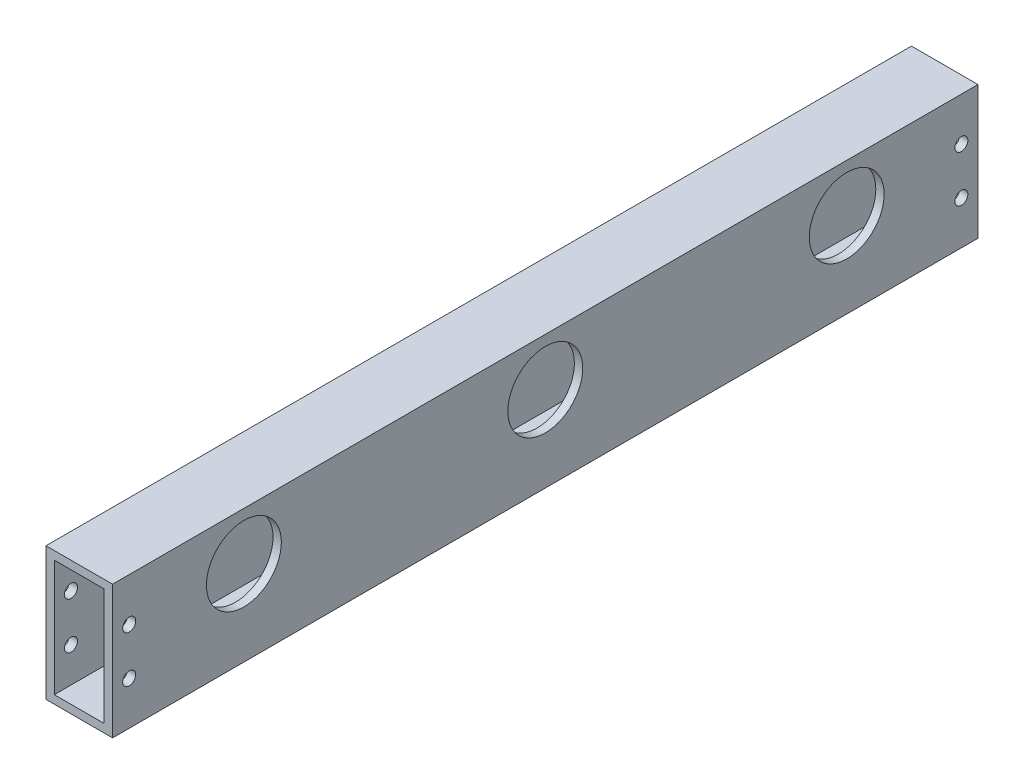
ISO-10303-21;
HEADER;
FILE_DESCRIPTION(('STEP AP214'),'2;1');
FILE_NAME('part.step','',(''),(''),'','','');
FILE_SCHEMA(('AUTOMOTIVE_DESIGN { 1 0 10303 214 1 1 1 1 }'));
ENDSEC;
DATA;
#1=APPLICATION_CONTEXT('core data for automotive mechanical design processes');
#2=APPLICATION_PROTOCOL_DEFINITION('international standard','automotive_design',2000,#1);
#3=PRODUCT_CONTEXT('',#1,'mechanical');
#4=PRODUCT('Part','Part','',(#3));
#5=PRODUCT_RELATED_PRODUCT_CATEGORY('part','',(#4));
#6=PRODUCT_DEFINITION_FORMATION('','',#4);
#7=PRODUCT_DEFINITION_CONTEXT('part definition',#1,'design');
#8=PRODUCT_DEFINITION('design','',#6,#7);
#9=PRODUCT_DEFINITION_SHAPE('','',#8);
#10=(LENGTH_UNIT() NAMED_UNIT(*) SI_UNIT(.MILLI.,.METRE.));
#11=(NAMED_UNIT(*) PLANE_ANGLE_UNIT() SI_UNIT($,.RADIAN.));
#12=(NAMED_UNIT(*) SI_UNIT($,.STERADIAN.) SOLID_ANGLE_UNIT());
#13=UNCERTAINTY_MEASURE_WITH_UNIT(LENGTH_MEASURE(1.E-05),#10,'distance_accuracy_value','');
#14=(GEOMETRIC_REPRESENTATION_CONTEXT(3) GLOBAL_UNCERTAINTY_ASSIGNED_CONTEXT((#13)) GLOBAL_UNIT_ASSIGNED_CONTEXT((#10,
#11,#12)) REPRESENTATION_CONTEXT('',''));
#15=CARTESIAN_POINT('',(0.,0.,0.));
#16=DIRECTION('',(0.,0.,1.));
#17=DIRECTION('',(1.,0.,0.));
#18=AXIS2_PLACEMENT_3D('',#15,#16,#17);
#19=CARTESIAN_POINT('',(25.4,0.,165.1));
#20=DIRECTION('',(0.,0.,-1.));
#21=DIRECTION('',(-1.,0.,0.));
#22=AXIS2_PLACEMENT_3D('',#19,#20,#21);
#23=PLANE('',#22);
#24=DIRECTION('',(0.,-1.,0.));
#25=VECTOR('',#24,1.);
#26=CARTESIAN_POINT('',(0.,0.,165.1));
#27=LINE('',#26,#25);
#28=CARTESIAN_POINT('',(0.,25.4,165.1));
#29=VERTEX_POINT('',#28);
#30=CARTESIAN_POINT('',(0.,-25.4,165.1));
#31=VERTEX_POINT('',#30);
#32=EDGE_CURVE('E226',#29,#31,#27,.T.);
#33=ORIENTED_EDGE('',*,*,#32,.T.);
#34=DIRECTION('',(-1.,0.,0.));
#35=VECTOR('',#34,1.);
#36=CARTESIAN_POINT('',(25.4,-25.4,165.1));
#37=LINE('',#36,#35);
#38=CARTESIAN_POINT('',(25.4,-25.4,165.1));
#39=VERTEX_POINT('',#38);
#40=EDGE_CURVE('E55',#39,#31,#37,.T.);
#41=ORIENTED_EDGE('',*,*,#40,.F.);
#42=DIRECTION('',(0.,-1.,0.));
#43=VECTOR('',#42,1.);
#44=CARTESIAN_POINT('',(25.4,0.,165.1));
#45=LINE('',#44,#43);
#46=CARTESIAN_POINT('',(25.4,25.4,165.1));
#47=VERTEX_POINT('',#46);
#48=EDGE_CURVE('E199',#47,#39,#45,.T.);
#49=ORIENTED_EDGE('',*,*,#48,.F.);
#50=DIRECTION('',(-1.,0.,0.));
#51=VECTOR('',#50,1.);
#52=CARTESIAN_POINT('',(25.4,25.4,165.1));
#53=LINE('',#52,#51);
#54=EDGE_CURVE('E11',#47,#29,#53,.T.);
#55=ORIENTED_EDGE('',*,*,#54,.T.);
#56=EDGE_LOOP('',(#33,#41,#49,#55));
#57=FACE_BOUND('',#56,.T.);
#58=DIRECTION('',(0.,-1.,0.));
#59=VECTOR('',#58,1.);
#60=CARTESIAN_POINT('',(3.175,0.,165.1));
#61=LINE('',#60,#59);
#62=CARTESIAN_POINT('',(3.175,22.225,165.1));
#63=VERTEX_POINT('',#62);
#64=CARTESIAN_POINT('',(3.175,-22.225,165.1));
#65=VERTEX_POINT('',#64);
#66=EDGE_CURVE('E127',#63,#65,#61,.T.);
#67=ORIENTED_EDGE('',*,*,#66,.F.);
#68=DIRECTION('',(-1.,0.,0.));
#69=VECTOR('',#68,1.);
#70=CARTESIAN_POINT('',(25.4,22.225,165.1));
#71=LINE('',#70,#69);
#72=CARTESIAN_POINT('',(22.225,22.225,165.1));
#73=VERTEX_POINT('',#72);
#74=EDGE_CURVE('E112',#73,#63,#71,.T.);
#75=ORIENTED_EDGE('',*,*,#74,.F.);
#76=DIRECTION('',(0.,-1.,0.));
#77=VECTOR('',#76,1.);
#78=CARTESIAN_POINT('',(22.225,0.,165.1));
#79=LINE('',#78,#77);
#80=CARTESIAN_POINT('',(22.225,-22.225,165.1));
#81=VERTEX_POINT('',#80);
#82=EDGE_CURVE('E145',#73,#81,#79,.T.);
#83=ORIENTED_EDGE('',*,*,#82,.T.);
#84=DIRECTION('',(-1.,0.,0.));
#85=VECTOR('',#84,1.);
#86=CARTESIAN_POINT('',(25.4,-22.225,165.1));
#87=LINE('',#86,#85);
#88=EDGE_CURVE('E122',#81,#65,#87,.T.);
#89=ORIENTED_EDGE('',*,*,#88,.T.);
#90=EDGE_LOOP('',(#67,#75,#83,#89));
#91=FACE_BOUND('',#90,.T.);
#92=ADVANCED_FACE('F45',(#57,#91),#23,.F.);
#93=CARTESIAN_POINT('',(25.4,7.112,0.));
#94=DIRECTION('',(-1.,0.,0.));
#95=DIRECTION('',(0.,0.,1.));
#96=AXIS2_PLACEMENT_3D('',#93,#94,#95);
#97=CYLINDRICAL_SURFACE('',#96,14.2875);
#98=CARTESIAN_POINT('',(0.,7.112,0.));
#99=DIRECTION('',(1.,0.,0.));
#100=DIRECTION('',(0.,0.,-1.));
#101=AXIS2_PLACEMENT_3D('',#98,#99,#100);
#102=CIRCLE('',#101,14.2875);
#103=CARTESIAN_POINT('',(0.,7.112,-14.2875));
#104=VERTEX_POINT('',#103);
#105=EDGE_CURVE('E218',#104,#104,#102,.T.);
#106=ORIENTED_EDGE('',*,*,#105,.F.);
#107=EDGE_LOOP('',(#106));
#108=FACE_BOUND('',#107,.T.);
#109=CARTESIAN_POINT('',(3.175,7.112,0.));
#110=DIRECTION('',(1.,0.,0.));
#111=DIRECTION('',(0.,0.,-1.));
#112=AXIS2_PLACEMENT_3D('',#109,#110,#111);
#113=CIRCLE('',#112,14.2875);
#114=CARTESIAN_POINT('',(3.175,7.112,-14.2875));
#115=VERTEX_POINT('',#114);
#116=EDGE_CURVE('E133',#115,#115,#113,.T.);
#117=ORIENTED_EDGE('',*,*,#116,.T.);
#118=EDGE_LOOP('',(#117));
#119=FACE_BOUND('',#118,.T.);
#120=ADVANCED_FACE('F307',(#108,#119),#97,.F.);
#121=CARTESIAN_POINT('',(25.4,7.11200000000001,115.));
#122=DIRECTION('',(-1.,0.,0.));
#123=DIRECTION('',(0.,0.,1.));
#124=AXIS2_PLACEMENT_3D('',#121,#122,#123);
#125=CYLINDRICAL_SURFACE('',#124,14.2875);
#126=CARTESIAN_POINT('',(0.,7.11200000000001,115.));
#127=DIRECTION('',(1.,0.,0.));
#128=DIRECTION('',(0.,0.,-1.));
#129=AXIS2_PLACEMENT_3D('',#126,#127,#128);
#130=CIRCLE('',#129,14.2875);
#131=CARTESIAN_POINT('',(0.,7.11200000000001,100.7125));
#132=VERTEX_POINT('',#131);
#133=EDGE_CURVE('E214',#132,#132,#130,.T.);
#134=ORIENTED_EDGE('',*,*,#133,.F.);
#135=EDGE_LOOP('',(#134));
#136=FACE_BOUND('',#135,.T.);
#137=CARTESIAN_POINT('',(3.175,7.11200000000001,115.));
#138=DIRECTION('',(1.,0.,0.));
#139=DIRECTION('',(0.,0.,-1.));
#140=AXIS2_PLACEMENT_3D('',#137,#138,#139);
#141=CIRCLE('',#140,14.2875);
#142=CARTESIAN_POINT('',(3.175,7.11200000000001,100.7125));
#143=VERTEX_POINT('',#142);
#144=EDGE_CURVE('E174',#143,#143,#141,.T.);
#145=ORIENTED_EDGE('',*,*,#144,.T.);
#146=EDGE_LOOP('',(#145));
#147=FACE_BOUND('',#146,.T.);
#148=ADVANCED_FACE('F301',(#136,#147),#125,.F.);
#149=CARTESIAN_POINT('',(25.4,7.112,-115.));
#150=DIRECTION('',(-1.,0.,0.));
#151=DIRECTION('',(0.,0.,1.));
#152=AXIS2_PLACEMENT_3D('',#149,#150,#151);
#153=CYLINDRICAL_SURFACE('',#152,14.2875);
#154=CARTESIAN_POINT('',(0.,7.112,-115.));
#155=DIRECTION('',(1.,0.,0.));
#156=DIRECTION('',(0.,0.,-1.));
#157=AXIS2_PLACEMENT_3D('',#154,#155,#156);
#158=CIRCLE('',#157,14.2875);
#159=CARTESIAN_POINT('',(0.,7.112,-129.2875));
#160=VERTEX_POINT('',#159);
#161=EDGE_CURVE('E121',#160,#160,#158,.T.);
#162=ORIENTED_EDGE('',*,*,#161,.F.);
#163=EDGE_LOOP('',(#162));
#164=FACE_BOUND('',#163,.T.);
#165=CARTESIAN_POINT('',(3.175,7.112,-115.));
#166=DIRECTION('',(1.,0.,0.));
#167=DIRECTION('',(0.,0.,-1.));
#168=AXIS2_PLACEMENT_3D('',#165,#166,#167);
#169=CIRCLE('',#168,14.2875);
#170=CARTESIAN_POINT('',(3.175,7.112,-129.2875));
#171=VERTEX_POINT('',#170);
#172=EDGE_CURVE('E170',#171,#171,#169,.T.);
#173=ORIENTED_EDGE('',*,*,#172,.T.);
#174=EDGE_LOOP('',(#173));
#175=FACE_BOUND('',#174,.T.);
#176=ADVANCED_FACE('F291',(#164,#175),#153,.F.);
#177=CARTESIAN_POINT('',(25.4,0.,-165.1));
#178=DIRECTION('',(0.,0.,-1.));
#179=DIRECTION('',(-1.,0.,0.));
#180=AXIS2_PLACEMENT_3D('',#177,#178,#179);
#181=PLANE('',#180);
#182=DIRECTION('',(0.,-1.,0.));
#183=VECTOR('',#182,1.);
#184=CARTESIAN_POINT('',(0.,0.,-165.1));
#185=LINE('',#184,#183);
#186=CARTESIAN_POINT('',(0.,25.4,-165.1));
#187=VERTEX_POINT('',#186);
#188=CARTESIAN_POINT('',(0.,-25.4,-165.1));
#189=VERTEX_POINT('',#188);
#190=EDGE_CURVE('E187',#187,#189,#185,.T.);
#191=ORIENTED_EDGE('',*,*,#190,.F.);
#192=DIRECTION('',(-1.,0.,0.));
#193=VECTOR('',#192,1.);
#194=CARTESIAN_POINT('',(25.4,25.4,-165.1));
#195=LINE('',#194,#193);
#196=CARTESIAN_POINT('',(25.4,25.4,-165.1));
#197=VERTEX_POINT('',#196);
#198=EDGE_CURVE('E210',#197,#187,#195,.T.);
#199=ORIENTED_EDGE('',*,*,#198,.F.);
#200=DIRECTION('',(0.,-1.,0.));
#201=VECTOR('',#200,1.);
#202=CARTESIAN_POINT('',(25.4,0.,-165.1));
#203=LINE('',#202,#201);
#204=CARTESIAN_POINT('',(25.4,-25.4,-165.1));
#205=VERTEX_POINT('',#204);
#206=EDGE_CURVE('E206',#197,#205,#203,.T.);
#207=ORIENTED_EDGE('',*,*,#206,.T.);
#208=DIRECTION('',(-1.,0.,0.));
#209=VECTOR('',#208,1.);
#210=CARTESIAN_POINT('',(25.4,-25.4,-165.1));
#211=LINE('',#210,#209);
#212=EDGE_CURVE('E239',#205,#189,#211,.T.);
#213=ORIENTED_EDGE('',*,*,#212,.T.);
#214=EDGE_LOOP('',(#191,#199,#207,#213));
#215=FACE_BOUND('',#214,.T.);
#216=DIRECTION('',(-1.,0.,0.));
#217=VECTOR('',#216,1.);
#218=CARTESIAN_POINT('',(25.4,22.225,-165.1));
#219=LINE('',#218,#217);
#220=CARTESIAN_POINT('',(22.225,22.225,-165.1));
#221=VERTEX_POINT('',#220);
#222=CARTESIAN_POINT('',(3.175,22.225,-165.1));
#223=VERTEX_POINT('',#222);
#224=EDGE_CURVE('E149',#221,#223,#219,.T.);
#225=ORIENTED_EDGE('',*,*,#224,.T.);
#226=DIRECTION('',(0.,-1.,0.));
#227=VECTOR('',#226,1.);
#228=CARTESIAN_POINT('',(3.175,0.,-165.1));
#229=LINE('',#228,#227);
#230=CARTESIAN_POINT('',(3.175,-22.225,-165.1));
#231=VERTEX_POINT('',#230);
#232=EDGE_CURVE('E130',#223,#231,#229,.T.);
#233=ORIENTED_EDGE('',*,*,#232,.T.);
#234=DIRECTION('',(-1.,0.,0.));
#235=VECTOR('',#234,1.);
#236=CARTESIAN_POINT('',(25.4,-22.225,-165.1));
#237=LINE('',#236,#235);
#238=CARTESIAN_POINT('',(22.225,-22.225,-165.1));
#239=VERTEX_POINT('',#238);
#240=EDGE_CURVE('E144',#239,#231,#237,.T.);
#241=ORIENTED_EDGE('',*,*,#240,.F.);
#242=DIRECTION('',(0.,-1.,0.));
#243=VECTOR('',#242,1.);
#244=CARTESIAN_POINT('',(22.225,0.,-165.1));
#245=LINE('',#244,#243);
#246=EDGE_CURVE('E70',#221,#239,#245,.T.);
#247=ORIENTED_EDGE('',*,*,#246,.F.);
#248=EDGE_LOOP('',(#225,#233,#241,#247));
#249=FACE_BOUND('',#248,.T.);
#250=ADVANCED_FACE('F288',(#215,#249),#181,.T.);
#251=CARTESIAN_POINT('',(25.4,25.4,0.));
#252=DIRECTION('',(0.,-1.,0.));
#253=DIRECTION('',(0.,0.,-1.));
#254=AXIS2_PLACEMENT_3D('',#251,#252,#253);
#255=PLANE('',#254);
#256=DIRECTION('',(0.,0.,1.));
#257=VECTOR('',#256,1.);
#258=CARTESIAN_POINT('',(0.,25.4,0.));
#259=LINE('',#258,#257);
#260=EDGE_CURVE('E222',#187,#29,#259,.T.);
#261=ORIENTED_EDGE('',*,*,#260,.T.);
#262=ORIENTED_EDGE('',*,*,#54,.F.);
#263=DIRECTION('',(0.,0.,1.));
#264=VECTOR('',#263,1.);
#265=CARTESIAN_POINT('',(25.4,25.4,0.));
#266=LINE('',#265,#264);
#267=EDGE_CURVE('E195',#197,#47,#266,.T.);
#268=ORIENTED_EDGE('',*,*,#267,.F.);
#269=ORIENTED_EDGE('',*,*,#198,.T.);
#270=EDGE_LOOP('',(#261,#262,#268,#269));
#271=FACE_BOUND('',#270,.T.);
#272=ADVANCED_FACE('F290',(#271),#255,.F.);
#273=CARTESIAN_POINT('',(25.4,-25.4,0.));
#274=DIRECTION('',(0.,-1.,0.));
#275=DIRECTION('',(0.,0.,-1.));
#276=AXIS2_PLACEMENT_3D('',#273,#274,#275);
#277=PLANE('',#276);
#278=DIRECTION('',(0.,0.,1.));
#279=VECTOR('',#278,1.);
#280=CARTESIAN_POINT('',(0.,-25.4,0.));
#281=LINE('',#280,#279);
#282=EDGE_CURVE('E230',#189,#31,#281,.T.);
#283=ORIENTED_EDGE('',*,*,#282,.F.);
#284=ORIENTED_EDGE('',*,*,#212,.F.);
#285=DIRECTION('',(0.,0.,1.));
#286=VECTOR('',#285,1.);
#287=CARTESIAN_POINT('',(25.4,-25.4,0.));
#288=LINE('',#287,#286);
#289=EDGE_CURVE('E202',#205,#39,#288,.T.);
#290=ORIENTED_EDGE('',*,*,#289,.T.);
#291=ORIENTED_EDGE('',*,*,#40,.T.);
#292=EDGE_LOOP('',(#283,#284,#290,#291));
#293=FACE_BOUND('',#292,.T.);
#294=ADVANCED_FACE('F298',(#293),#277,.T.);
#295=CARTESIAN_POINT('',(22.225,7.112,0.));
#296=DIRECTION('',(1.,0.,0.));
#297=DIRECTION('',(0.,0.,-1.));
#298=AXIS2_PLACEMENT_3D('',#295,#296,#297);
#299=CIRCLE('',#298,14.2875);
#300=CARTESIAN_POINT('',(22.225,7.112,-14.2875));
#301=VERTEX_POINT('',#300);
#302=EDGE_CURVE('E166',#301,#301,#299,.T.);
#303=ORIENTED_EDGE('',*,*,#302,.F.);
#304=EDGE_LOOP('',(#303));
#305=FACE_BOUND('',#304,.T.);
#306=CARTESIAN_POINT('',(25.4,7.112,0.));
#307=DIRECTION('',(1.,0.,0.));
#308=DIRECTION('',(0.,0.,-1.));
#309=AXIS2_PLACEMENT_3D('',#306,#307,#308);
#310=CIRCLE('',#309,14.2875);
#311=CARTESIAN_POINT('',(25.4,7.112,-14.2875));
#312=VERTEX_POINT('',#311);
#313=EDGE_CURVE('E191',#312,#312,#310,.T.);
#314=ORIENTED_EDGE('',*,*,#313,.T.);
#315=EDGE_LOOP('',(#314));
#316=FACE_BOUND('',#315,.T.);
#317=ADVANCED_FACE('F315',(#305,#316),#97,.F.);
#318=CARTESIAN_POINT('',(22.225,7.11200000000001,115.));
#319=DIRECTION('',(1.,0.,0.));
#320=DIRECTION('',(0.,0.,-1.));
#321=AXIS2_PLACEMENT_3D('',#318,#319,#320);
#322=CIRCLE('',#321,14.2875);
#323=CARTESIAN_POINT('',(22.225,7.11200000000001,100.7125));
#324=VERTEX_POINT('',#323);
#325=EDGE_CURVE('E162',#324,#324,#322,.T.);
#326=ORIENTED_EDGE('',*,*,#325,.F.);
#327=EDGE_LOOP('',(#326));
#328=FACE_BOUND('',#327,.T.);
#329=CARTESIAN_POINT('',(25.4,7.11200000000001,115.));
#330=DIRECTION('',(1.,0.,0.));
#331=DIRECTION('',(0.,0.,-1.));
#332=AXIS2_PLACEMENT_3D('',#329,#330,#331);
#333=CIRCLE('',#332,14.2875);
#334=CARTESIAN_POINT('',(25.4,7.11200000000001,100.7125));
#335=VERTEX_POINT('',#334);
#336=EDGE_CURVE('E186',#335,#335,#333,.T.);
#337=ORIENTED_EDGE('',*,*,#336,.T.);
#338=EDGE_LOOP('',(#337));
#339=FACE_BOUND('',#338,.T.);
#340=ADVANCED_FACE('F317',(#328,#339),#125,.F.);
#341=CARTESIAN_POINT('',(22.225,7.112,-115.));
#342=DIRECTION('',(1.,0.,0.));
#343=DIRECTION('',(0.,0.,-1.));
#344=AXIS2_PLACEMENT_3D('',#341,#342,#343);
#345=CIRCLE('',#344,14.2875);
#346=CARTESIAN_POINT('',(22.225,7.112,-129.2875));
#347=VERTEX_POINT('',#346);
#348=EDGE_CURVE('E158',#347,#347,#345,.T.);
#349=ORIENTED_EDGE('',*,*,#348,.F.);
#350=EDGE_LOOP('',(#349));
#351=FACE_BOUND('',#350,.T.);
#352=CARTESIAN_POINT('',(25.4,7.112,-115.));
#353=DIRECTION('',(1.,0.,0.));
#354=DIRECTION('',(0.,0.,-1.));
#355=AXIS2_PLACEMENT_3D('',#352,#353,#354);
#356=CIRCLE('',#355,14.2875);
#357=CARTESIAN_POINT('',(25.4,7.112,-129.2875));
#358=VERTEX_POINT('',#357);
#359=EDGE_CURVE('E182',#358,#358,#356,.T.);
#360=ORIENTED_EDGE('',*,*,#359,.T.);
#361=EDGE_LOOP('',(#360));
#362=FACE_BOUND('',#361,.T.);
#363=ADVANCED_FACE('F47',(#351,#362),#153,.F.);
#364=CARTESIAN_POINT('',(25.4,0.,0.));
#365=DIRECTION('',(1.,0.,0.));
#366=DIRECTION('',(0.,0.,-1.));
#367=AXIS2_PLACEMENT_3D('',#364,#365,#366);
#368=PLANE('',#367);
#369=CARTESIAN_POINT('',(25.4,8.89,-158.75));
#370=DIRECTION('',(1.,0.,0.));
#371=DIRECTION('',(0.,0.,-1.));
#372=AXIS2_PLACEMENT_3D('',#369,#370,#371);
#373=CIRCLE('',#372,2.4892);
#374=CARTESIAN_POINT('',(25.4,8.89,-161.2392));
#375=VERTEX_POINT('',#374);
#376=EDGE_CURVE('E596',#375,#375,#373,.T.);
#377=ORIENTED_EDGE('',*,*,#376,.F.);
#378=EDGE_LOOP('',(#377));
#379=FACE_BOUND('',#378,.T.);
#380=CARTESIAN_POINT('',(25.4,-8.89,-158.75));
#381=DIRECTION('',(1.,0.,0.));
#382=DIRECTION('',(0.,0.,-1.));
#383=AXIS2_PLACEMENT_3D('',#380,#381,#382);
#384=CIRCLE('',#383,2.4892);
#385=CARTESIAN_POINT('',(25.4,-8.89,-161.2392));
#386=VERTEX_POINT('',#385);
#387=EDGE_CURVE('E606',#386,#386,#384,.T.);
#388=ORIENTED_EDGE('',*,*,#387,.F.);
#389=EDGE_LOOP('',(#388));
#390=FACE_BOUND('',#389,.T.);
#391=CARTESIAN_POINT('',(25.4,8.89,158.75));
#392=DIRECTION('',(1.,0.,0.));
#393=DIRECTION('',(0.,0.,-1.));
#394=AXIS2_PLACEMENT_3D('',#391,#392,#393);
#395=CIRCLE('',#394,2.4892);
#396=CARTESIAN_POINT('',(25.4,8.89,156.2608));
#397=VERTEX_POINT('',#396);
#398=EDGE_CURVE('E256',#397,#397,#395,.T.);
#399=ORIENTED_EDGE('',*,*,#398,.F.);
#400=EDGE_LOOP('',(#399));
#401=FACE_BOUND('',#400,.T.);
#402=CARTESIAN_POINT('',(25.4,-8.89,158.75));
#403=DIRECTION('',(1.,0.,0.));
#404=DIRECTION('',(0.,0.,-1.));
#405=AXIS2_PLACEMENT_3D('',#402,#403,#404);
#406=CIRCLE('',#405,2.4892);
#407=CARTESIAN_POINT('',(25.4,-8.89,156.2608));
#408=VERTEX_POINT('',#407);
#409=EDGE_CURVE('E253',#408,#408,#406,.T.);
#410=ORIENTED_EDGE('',*,*,#409,.F.);
#411=EDGE_LOOP('',(#410));
#412=FACE_BOUND('',#411,.T.);
#413=ORIENTED_EDGE('',*,*,#359,.F.);
#414=EDGE_LOOP('',(#413));
#415=FACE_BOUND('',#414,.T.);
#416=ORIENTED_EDGE('',*,*,#336,.F.);
#417=EDGE_LOOP('',(#416));
#418=FACE_BOUND('',#417,.T.);
#419=ORIENTED_EDGE('',*,*,#313,.F.);
#420=EDGE_LOOP('',(#419));
#421=FACE_BOUND('',#420,.T.);
#422=ORIENTED_EDGE('',*,*,#267,.T.);
#423=ORIENTED_EDGE('',*,*,#48,.T.);
#424=ORIENTED_EDGE('',*,*,#289,.F.);
#425=ORIENTED_EDGE('',*,*,#206,.F.);
#426=EDGE_LOOP('',(#422,#423,#424,#425));
#427=FACE_BOUND('',#426,.T.);
#428=ADVANCED_FACE('F324',(#379,#390,#401,#412,#415,#418,#421,#427),#368,.T.);
#429=CARTESIAN_POINT('',(0.,0.,0.));
#430=DIRECTION('',(1.,0.,0.));
#431=DIRECTION('',(0.,0.,-1.));
#432=AXIS2_PLACEMENT_3D('',#429,#430,#431);
#433=PLANE('',#432);
#434=CARTESIAN_POINT('',(0.,8.89,-158.75));
#435=DIRECTION('',(1.,0.,0.));
#436=DIRECTION('',(0.,0.,-1.));
#437=AXIS2_PLACEMENT_3D('',#434,#435,#436);
#438=CIRCLE('',#437,2.48919999999999);
#439=CARTESIAN_POINT('',(0.,8.89,-161.2392));
#440=VERTEX_POINT('',#439);
#441=EDGE_CURVE('E368',#440,#440,#438,.T.);
#442=ORIENTED_EDGE('',*,*,#441,.T.);
#443=EDGE_LOOP('',(#442));
#444=FACE_BOUND('',#443,.T.);
#445=CARTESIAN_POINT('',(0.,-8.89,-158.75));
#446=DIRECTION('',(1.,0.,0.));
#447=DIRECTION('',(0.,0.,-1.));
#448=AXIS2_PLACEMENT_3D('',#445,#446,#447);
#449=CIRCLE('',#448,2.48919999999999);
#450=CARTESIAN_POINT('',(0.,-8.89,-161.2392));
#451=VERTEX_POINT('',#450);
#452=EDGE_CURVE('E371',#451,#451,#449,.T.);
#453=ORIENTED_EDGE('',*,*,#452,.T.);
#454=EDGE_LOOP('',(#453));
#455=FACE_BOUND('',#454,.T.);
#456=CARTESIAN_POINT('',(0.,8.89,158.75));
#457=DIRECTION('',(1.,0.,0.));
#458=DIRECTION('',(0.,0.,-1.));
#459=AXIS2_PLACEMENT_3D('',#456,#457,#458);
#460=CIRCLE('',#459,2.48919999999999);
#461=CARTESIAN_POINT('',(0.,8.89,156.2608));
#462=VERTEX_POINT('',#461);
#463=EDGE_CURVE('E247',#462,#462,#460,.T.);
#464=ORIENTED_EDGE('',*,*,#463,.T.);
#465=EDGE_LOOP('',(#464));
#466=FACE_BOUND('',#465,.T.);
#467=CARTESIAN_POINT('',(0.,-8.89,158.75));
#468=DIRECTION('',(1.,0.,0.));
#469=DIRECTION('',(0.,0.,-1.));
#470=AXIS2_PLACEMENT_3D('',#467,#468,#469);
#471=CIRCLE('',#470,2.48919999999999);
#472=CARTESIAN_POINT('',(0.,-8.89,156.2608));
#473=VERTEX_POINT('',#472);
#474=EDGE_CURVE('E269',#473,#473,#471,.T.);
#475=ORIENTED_EDGE('',*,*,#474,.T.);
#476=EDGE_LOOP('',(#475));
#477=FACE_BOUND('',#476,.T.);
#478=ORIENTED_EDGE('',*,*,#161,.T.);
#479=EDGE_LOOP('',(#478));
#480=FACE_BOUND('',#479,.T.);
#481=ORIENTED_EDGE('',*,*,#133,.T.);
#482=EDGE_LOOP('',(#481));
#483=FACE_BOUND('',#482,.T.);
#484=ORIENTED_EDGE('',*,*,#105,.T.);
#485=EDGE_LOOP('',(#484));
#486=FACE_BOUND('',#485,.T.);
#487=ORIENTED_EDGE('',*,*,#260,.F.);
#488=ORIENTED_EDGE('',*,*,#190,.T.);
#489=ORIENTED_EDGE('',*,*,#282,.T.);
#490=ORIENTED_EDGE('',*,*,#32,.F.);
#491=EDGE_LOOP('',(#487,#488,#489,#490));
#492=FACE_BOUND('',#491,.T.);
#493=ADVANCED_FACE('F357',(#444,#455,#466,#477,#480,#483,#486,#492),#433,.F.);
#494=CARTESIAN_POINT('',(25.4,22.225,0.));
#495=DIRECTION('',(0.,-1.,0.));
#496=DIRECTION('',(0.,0.,-1.));
#497=AXIS2_PLACEMENT_3D('',#494,#495,#496);
#498=PLANE('',#497);
#499=DIRECTION('',(0.,0.,1.));
#500=VECTOR('',#499,1.);
#501=CARTESIAN_POINT('',(3.175,22.225,0.));
#502=LINE('',#501,#500);
#503=EDGE_CURVE('E115',#223,#63,#502,.T.);
#504=ORIENTED_EDGE('',*,*,#503,.F.);
#505=ORIENTED_EDGE('',*,*,#224,.F.);
#506=DIRECTION('',(0.,0.,1.));
#507=VECTOR('',#506,1.);
#508=CARTESIAN_POINT('',(22.225,22.225,0.));
#509=LINE('',#508,#507);
#510=EDGE_CURVE('E63',#221,#73,#509,.T.);
#511=ORIENTED_EDGE('',*,*,#510,.T.);
#512=ORIENTED_EDGE('',*,*,#74,.T.);
#513=EDGE_LOOP('',(#504,#505,#511,#512));
#514=FACE_BOUND('',#513,.T.);
#515=ADVANCED_FACE('F114',(#514),#498,.T.);
#516=CARTESIAN_POINT('',(25.4,-22.225,0.));
#517=DIRECTION('',(0.,-1.,0.));
#518=DIRECTION('',(0.,0.,-1.));
#519=AXIS2_PLACEMENT_3D('',#516,#517,#518);
#520=PLANE('',#519);
#521=DIRECTION('',(0.,0.,1.));
#522=VECTOR('',#521,1.);
#523=CARTESIAN_POINT('',(3.175,-22.225,0.));
#524=LINE('',#523,#522);
#525=EDGE_CURVE('E137',#231,#65,#524,.T.);
#526=ORIENTED_EDGE('',*,*,#525,.T.);
#527=ORIENTED_EDGE('',*,*,#88,.F.);
#528=DIRECTION('',(0.,0.,1.));
#529=VECTOR('',#528,1.);
#530=CARTESIAN_POINT('',(22.225,-22.225,0.));
#531=LINE('',#530,#529);
#532=EDGE_CURVE('E148',#239,#81,#531,.T.);
#533=ORIENTED_EDGE('',*,*,#532,.F.);
#534=ORIENTED_EDGE('',*,*,#240,.T.);
#535=EDGE_LOOP('',(#526,#527,#533,#534));
#536=FACE_BOUND('',#535,.T.);
#537=ADVANCED_FACE('F286',(#536),#520,.F.);
#538=CARTESIAN_POINT('',(22.225,0.,0.));
#539=DIRECTION('',(1.,0.,0.));
#540=DIRECTION('',(0.,0.,-1.));
#541=AXIS2_PLACEMENT_3D('',#538,#539,#540);
#542=PLANE('',#541);
#543=CARTESIAN_POINT('',(22.225,8.89,-158.75));
#544=DIRECTION('',(1.,0.,0.));
#545=DIRECTION('',(0.,0.,-1.));
#546=AXIS2_PLACEMENT_3D('',#543,#544,#545);
#547=CIRCLE('',#546,2.4892);
#548=CARTESIAN_POINT('',(22.225,8.89,-161.2392));
#549=VERTEX_POINT('',#548);
#550=EDGE_CURVE('E599',#549,#549,#547,.T.);
#551=ORIENTED_EDGE('',*,*,#550,.T.);
#552=EDGE_LOOP('',(#551));
#553=FACE_BOUND('',#552,.T.);
#554=CARTESIAN_POINT('',(22.225,-8.89,-158.75));
#555=DIRECTION('',(1.,0.,0.));
#556=DIRECTION('',(0.,0.,-1.));
#557=AXIS2_PLACEMENT_3D('',#554,#555,#556);
#558=CIRCLE('',#557,2.4892);
#559=CARTESIAN_POINT('',(22.225,-8.89,-161.2392));
#560=VERTEX_POINT('',#559);
#561=EDGE_CURVE('E262',#560,#560,#558,.T.);
#562=ORIENTED_EDGE('',*,*,#561,.T.);
#563=EDGE_LOOP('',(#562));
#564=FACE_BOUND('',#563,.T.);
#565=CARTESIAN_POINT('',(22.225,8.89,158.75));
#566=DIRECTION('',(1.,0.,0.));
#567=DIRECTION('',(0.,0.,-1.));
#568=AXIS2_PLACEMENT_3D('',#565,#566,#567);
#569=CIRCLE('',#568,2.4892);
#570=CARTESIAN_POINT('',(22.225,8.89,156.2608));
#571=VERTEX_POINT('',#570);
#572=EDGE_CURVE('E246',#571,#571,#569,.T.);
#573=ORIENTED_EDGE('',*,*,#572,.T.);
#574=EDGE_LOOP('',(#573));
#575=FACE_BOUND('',#574,.T.);
#576=CARTESIAN_POINT('',(22.225,-8.89,158.75));
#577=DIRECTION('',(1.,0.,0.));
#578=DIRECTION('',(0.,0.,-1.));
#579=AXIS2_PLACEMENT_3D('',#576,#577,#578);
#580=CIRCLE('',#579,2.4892);
#581=CARTESIAN_POINT('',(22.225,-8.89,156.2608));
#582=VERTEX_POINT('',#581);
#583=EDGE_CURVE('E175',#582,#582,#580,.T.);
#584=ORIENTED_EDGE('',*,*,#583,.T.);
#585=EDGE_LOOP('',(#584));
#586=FACE_BOUND('',#585,.T.);
#587=ORIENTED_EDGE('',*,*,#348,.T.);
#588=EDGE_LOOP('',(#587));
#589=FACE_BOUND('',#588,.T.);
#590=ORIENTED_EDGE('',*,*,#325,.T.);
#591=EDGE_LOOP('',(#590));
#592=FACE_BOUND('',#591,.T.);
#593=ORIENTED_EDGE('',*,*,#302,.T.);
#594=EDGE_LOOP('',(#593));
#595=FACE_BOUND('',#594,.T.);
#596=ORIENTED_EDGE('',*,*,#510,.F.);
#597=ORIENTED_EDGE('',*,*,#246,.T.);
#598=ORIENTED_EDGE('',*,*,#532,.T.);
#599=ORIENTED_EDGE('',*,*,#82,.F.);
#600=EDGE_LOOP('',(#596,#597,#598,#599));
#601=FACE_BOUND('',#600,.T.);
#602=ADVANCED_FACE('F283',(#553,#564,#575,#586,#589,#592,#595,#601),#542,.F.);
#603=CARTESIAN_POINT('',(3.175,0.,0.));
#604=DIRECTION('',(1.,0.,0.));
#605=DIRECTION('',(0.,0.,-1.));
#606=AXIS2_PLACEMENT_3D('',#603,#604,#605);
#607=PLANE('',#606);
#608=CARTESIAN_POINT('',(3.175,8.89,-158.75));
#609=DIRECTION('',(1.,0.,0.));
#610=DIRECTION('',(0.,0.,-1.));
#611=AXIS2_PLACEMENT_3D('',#608,#609,#610);
#612=CIRCLE('',#611,2.4892);
#613=CARTESIAN_POINT('',(3.175,8.89,-161.2392));
#614=VERTEX_POINT('',#613);
#615=EDGE_CURVE('E601',#614,#614,#612,.T.);
#616=ORIENTED_EDGE('',*,*,#615,.F.);
#617=EDGE_LOOP('',(#616));
#618=FACE_BOUND('',#617,.T.);
#619=CARTESIAN_POINT('',(3.175,-8.89,-158.75));
#620=DIRECTION('',(1.,0.,0.));
#621=DIRECTION('',(0.,0.,-1.));
#622=AXIS2_PLACEMENT_3D('',#619,#620,#621);
#623=CIRCLE('',#622,2.4892);
#624=CARTESIAN_POINT('',(3.175,-8.89,-161.2392));
#625=VERTEX_POINT('',#624);
#626=EDGE_CURVE('E49',#625,#625,#623,.T.);
#627=ORIENTED_EDGE('',*,*,#626,.F.);
#628=EDGE_LOOP('',(#627));
#629=FACE_BOUND('',#628,.T.);
#630=CARTESIAN_POINT('',(3.175,8.89,158.75));
#631=DIRECTION('',(1.,0.,0.));
#632=DIRECTION('',(0.,0.,-1.));
#633=AXIS2_PLACEMENT_3D('',#630,#631,#632);
#634=CIRCLE('',#633,2.4892);
#635=CARTESIAN_POINT('',(3.175,8.89,156.2608));
#636=VERTEX_POINT('',#635);
#637=EDGE_CURVE('E243',#636,#636,#634,.T.);
#638=ORIENTED_EDGE('',*,*,#637,.F.);
#639=EDGE_LOOP('',(#638));
#640=FACE_BOUND('',#639,.T.);
#641=CARTESIAN_POINT('',(3.175,-8.89,158.75));
#642=DIRECTION('',(1.,0.,0.));
#643=DIRECTION('',(0.,0.,-1.));
#644=AXIS2_PLACEMENT_3D('',#641,#642,#643);
#645=CIRCLE('',#644,2.4892);
#646=CARTESIAN_POINT('',(3.175,-8.89,156.2608));
#647=VERTEX_POINT('',#646);
#648=EDGE_CURVE('E273',#647,#647,#645,.T.);
#649=ORIENTED_EDGE('',*,*,#648,.F.);
#650=EDGE_LOOP('',(#649));
#651=FACE_BOUND('',#650,.T.);
#652=ORIENTED_EDGE('',*,*,#172,.F.);
#653=EDGE_LOOP('',(#652));
#654=FACE_BOUND('',#653,.T.);
#655=ORIENTED_EDGE('',*,*,#144,.F.);
#656=EDGE_LOOP('',(#655));
#657=FACE_BOUND('',#656,.T.);
#658=ORIENTED_EDGE('',*,*,#116,.F.);
#659=EDGE_LOOP('',(#658));
#660=FACE_BOUND('',#659,.T.);
#661=ORIENTED_EDGE('',*,*,#503,.T.);
#662=ORIENTED_EDGE('',*,*,#66,.T.);
#663=ORIENTED_EDGE('',*,*,#525,.F.);
#664=ORIENTED_EDGE('',*,*,#232,.F.);
#665=EDGE_LOOP('',(#661,#662,#663,#664));
#666=FACE_BOUND('',#665,.T.);
#667=ADVANCED_FACE('F125',(#618,#629,#640,#651,#654,#657,#660,#666),#607,.T.);
#668=CARTESIAN_POINT('',(25.4,-8.89,158.75));
#669=DIRECTION('',(1.,0.,0.));
#670=DIRECTION('',(0.,0.,-1.));
#671=AXIS2_PLACEMENT_3D('',#668,#669,#670);
#672=CYLINDRICAL_SURFACE('',#671,2.4892);
#673=ORIENTED_EDGE('',*,*,#648,.T.);
#674=EDGE_LOOP('',(#673));
#675=FACE_BOUND('',#674,.T.);
#676=ORIENTED_EDGE('',*,*,#474,.F.);
#677=EDGE_LOOP('',(#676));
#678=FACE_BOUND('',#677,.T.);
#679=ADVANCED_FACE('F338',(#675,#678),#672,.F.);
#680=ORIENTED_EDGE('',*,*,#409,.T.);
#681=EDGE_LOOP('',(#680));
#682=FACE_BOUND('',#681,.T.);
#683=ORIENTED_EDGE('',*,*,#583,.F.);
#684=EDGE_LOOP('',(#683));
#685=FACE_BOUND('',#684,.T.);
#686=ADVANCED_FACE('F347',(#682,#685),#672,.F.);
#687=CARTESIAN_POINT('',(25.4,8.89,158.75));
#688=DIRECTION('',(1.,0.,0.));
#689=DIRECTION('',(0.,0.,-1.));
#690=AXIS2_PLACEMENT_3D('',#687,#688,#689);
#691=CYLINDRICAL_SURFACE('',#690,2.4892);
#692=ORIENTED_EDGE('',*,*,#637,.T.);
#693=EDGE_LOOP('',(#692));
#694=FACE_BOUND('',#693,.T.);
#695=ORIENTED_EDGE('',*,*,#463,.F.);
#696=EDGE_LOOP('',(#695));
#697=FACE_BOUND('',#696,.T.);
#698=ADVANCED_FACE('F449',(#694,#697),#691,.F.);
#699=ORIENTED_EDGE('',*,*,#398,.T.);
#700=EDGE_LOOP('',(#699));
#701=FACE_BOUND('',#700,.T.);
#702=ORIENTED_EDGE('',*,*,#572,.F.);
#703=EDGE_LOOP('',(#702));
#704=FACE_BOUND('',#703,.T.);
#705=ADVANCED_FACE('F459',(#701,#704),#691,.F.);
#706=CARTESIAN_POINT('',(25.4,-8.89,-158.75));
#707=DIRECTION('',(1.,0.,0.));
#708=DIRECTION('',(0.,0.,-1.));
#709=AXIS2_PLACEMENT_3D('',#706,#707,#708);
#710=CYLINDRICAL_SURFACE('',#709,2.4892);
#711=ORIENTED_EDGE('',*,*,#626,.T.);
#712=EDGE_LOOP('',(#711));
#713=FACE_BOUND('',#712,.T.);
#714=ORIENTED_EDGE('',*,*,#452,.F.);
#715=EDGE_LOOP('',(#714));
#716=FACE_BOUND('',#715,.T.);
#717=ADVANCED_FACE('F469',(#713,#716),#710,.F.);
#718=ORIENTED_EDGE('',*,*,#387,.T.);
#719=EDGE_LOOP('',(#718));
#720=FACE_BOUND('',#719,.T.);
#721=ORIENTED_EDGE('',*,*,#561,.F.);
#722=EDGE_LOOP('',(#721));
#723=FACE_BOUND('',#722,.T.);
#724=ADVANCED_FACE('F501',(#720,#723),#710,.F.);
#725=CARTESIAN_POINT('',(25.4,8.89,-158.75));
#726=DIRECTION('',(1.,0.,0.));
#727=DIRECTION('',(0.,0.,-1.));
#728=AXIS2_PLACEMENT_3D('',#725,#726,#727);
#729=CYLINDRICAL_SURFACE('',#728,2.4892);
#730=ORIENTED_EDGE('',*,*,#615,.T.);
#731=EDGE_LOOP('',(#730));
#732=FACE_BOUND('',#731,.T.);
#733=ORIENTED_EDGE('',*,*,#441,.F.);
#734=EDGE_LOOP('',(#733));
#735=FACE_BOUND('',#734,.T.);
#736=ADVANCED_FACE('F512',(#732,#735),#729,.F.);
#737=ORIENTED_EDGE('',*,*,#376,.T.);
#738=EDGE_LOOP('',(#737));
#739=FACE_BOUND('',#738,.T.);
#740=ORIENTED_EDGE('',*,*,#550,.F.);
#741=EDGE_LOOP('',(#740));
#742=FACE_BOUND('',#741,.T.);
#743=ADVANCED_FACE('F522',(#739,#742),#729,.F.);
#744=CLOSED_SHELL('',(#92,#120,#148,#176,#250,#272,#294,#317,#340,#363,#428,#493,#515,#537,#602,
#667,#679,#686,#698,#705,#717,#724,#736,#743));
#745=MANIFOLD_SOLID_BREP('B2',#744);
#746=ADVANCED_BREP_SHAPE_REPRESENTATION('',(#18,#745),#14);
#747=SHAPE_DEFINITION_REPRESENTATION(#9,#746);
ENDSEC;
END-ISO-10303-21;
